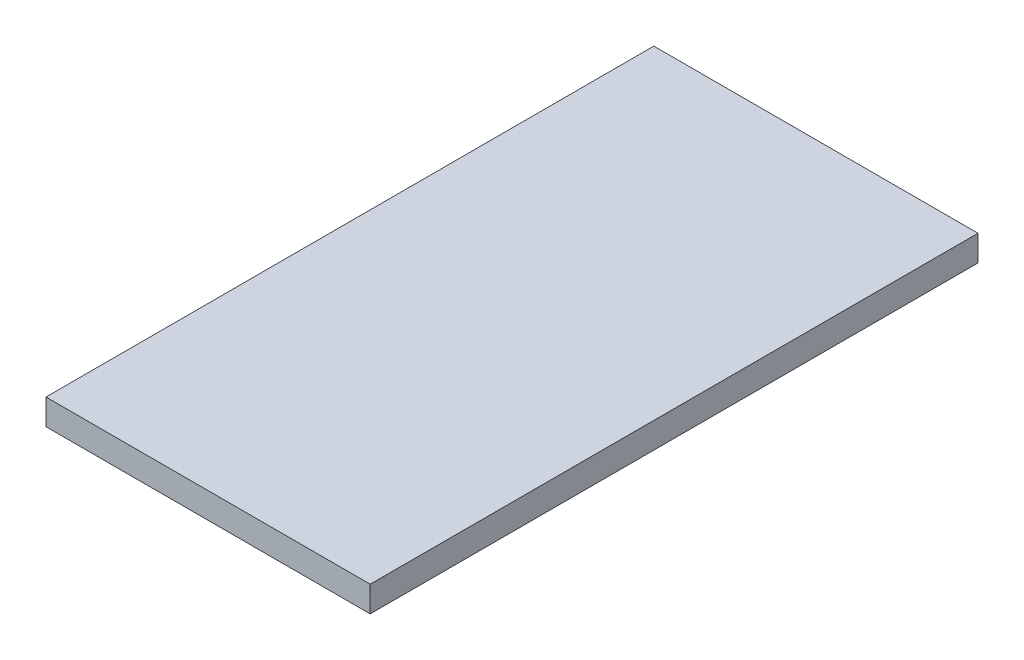
ISO-10303-21;
HEADER;
FILE_DESCRIPTION(('STEP AP214'),'2;1');
FILE_NAME('part.step','',(''),(''),'','','');
FILE_SCHEMA(('AUTOMOTIVE_DESIGN { 1 0 10303 214 1 1 1 1 }'));
ENDSEC;
DATA;
#1=APPLICATION_CONTEXT('core data for automotive mechanical design processes');
#2=APPLICATION_PROTOCOL_DEFINITION('international standard','automotive_design',2000,#1);
#3=PRODUCT_CONTEXT('',#1,'mechanical');
#4=PRODUCT('Part','Part','',(#3));
#5=PRODUCT_RELATED_PRODUCT_CATEGORY('part','',(#4));
#6=PRODUCT_DEFINITION_FORMATION('','',#4);
#7=PRODUCT_DEFINITION_CONTEXT('part definition',#1,'design');
#8=PRODUCT_DEFINITION('design','',#6,#7);
#9=PRODUCT_DEFINITION_SHAPE('','',#8);
#10=(LENGTH_UNIT() NAMED_UNIT(*) SI_UNIT(.MILLI.,.METRE.));
#11=(NAMED_UNIT(*) PLANE_ANGLE_UNIT() SI_UNIT($,.RADIAN.));
#12=(NAMED_UNIT(*) SI_UNIT($,.STERADIAN.) SOLID_ANGLE_UNIT());
#13=UNCERTAINTY_MEASURE_WITH_UNIT(LENGTH_MEASURE(1.E-05),#10,'distance_accuracy_value','');
#14=(GEOMETRIC_REPRESENTATION_CONTEXT(3) GLOBAL_UNCERTAINTY_ASSIGNED_CONTEXT((#13)) GLOBAL_UNIT_ASSIGNED_CONTEXT((#10,
#11,#12)) REPRESENTATION_CONTEXT('',''));
#15=CARTESIAN_POINT('',(0.,0.,0.));
#16=DIRECTION('',(0.,0.,1.));
#17=DIRECTION('',(1.,0.,0.));
#18=AXIS2_PLACEMENT_3D('',#15,#16,#17);
#19=CARTESIAN_POINT('',(0.,0.,0.));
#20=DIRECTION('',(0.,1.,0.));
#21=DIRECTION('',(0.,0.,1.));
#22=AXIS2_PLACEMENT_3D('',#19,#20,#21);
#23=PLANE('',#22);
#24=DIRECTION('',(-1.,0.,0.));
#25=VECTOR('',#24,1.);
#26=CARTESIAN_POINT('',(-160.,0.,300.));
#27=LINE('',#26,#25);
#28=CARTESIAN_POINT('',(160.,0.,300.));
#29=VERTEX_POINT('',#28);
#30=CARTESIAN_POINT('',(-160.,0.,300.));
#31=VERTEX_POINT('',#30);
#32=EDGE_CURVE('E81',#29,#31,#27,.T.);
#33=ORIENTED_EDGE('',*,*,#32,.T.);
#34=DIRECTION('',(0.,0.,-1.));
#35=VECTOR('',#34,1.);
#36=CARTESIAN_POINT('',(-160.,0.,-300.));
#37=LINE('',#36,#35);
#38=CARTESIAN_POINT('',(-160.,0.,-300.));
#39=VERTEX_POINT('',#38);
#40=EDGE_CURVE('E68',#31,#39,#37,.T.);
#41=ORIENTED_EDGE('',*,*,#40,.T.);
#42=DIRECTION('',(1.,0.,0.));
#43=VECTOR('',#42,1.);
#44=CARTESIAN_POINT('',(-160.,0.,-300.));
#45=LINE('',#44,#43);
#46=CARTESIAN_POINT('',(160.,0.,-300.));
#47=VERTEX_POINT('',#46);
#48=EDGE_CURVE('E55',#39,#47,#45,.T.);
#49=ORIENTED_EDGE('',*,*,#48,.T.);
#50=DIRECTION('',(0.,0.,1.));
#51=VECTOR('',#50,1.);
#52=CARTESIAN_POINT('',(160.,0.,-300.));
#53=LINE('',#52,#51);
#54=EDGE_CURVE('E20',#47,#29,#53,.T.);
#55=ORIENTED_EDGE('',*,*,#54,.T.);
#56=EDGE_LOOP('',(#33,#41,#49,#55));
#57=FACE_BOUND('',#56,.T.);
#58=ADVANCED_FACE('F17',(#57),#23,.F.);
#59=CARTESIAN_POINT('',(160.,25.4,-300.));
#60=DIRECTION('',(-1.,0.,0.));
#61=DIRECTION('',(0.,0.,1.));
#62=AXIS2_PLACEMENT_3D('',#59,#60,#61);
#63=PLANE('',#62);
#64=DIRECTION('',(0.,1.,0.));
#65=VECTOR('',#64,1.);
#66=CARTESIAN_POINT('',(160.,25.4,-300.));
#67=LINE('',#66,#65);
#68=CARTESIAN_POINT('',(160.,25.4,-300.));
#69=VERTEX_POINT('',#68);
#70=EDGE_CURVE('E61',#47,#69,#67,.T.);
#71=ORIENTED_EDGE('',*,*,#70,.T.);
#72=DIRECTION('',(0.,0.,1.));
#73=VECTOR('',#72,1.);
#74=CARTESIAN_POINT('',(160.,25.4,0.));
#75=LINE('',#74,#73);
#76=CARTESIAN_POINT('',(160.,25.4,300.));
#77=VERTEX_POINT('',#76);
#78=EDGE_CURVE('E83',#77,#69,#75,.F.);
#79=ORIENTED_EDGE('',*,*,#78,.F.);
#80=DIRECTION('',(0.,1.,0.));
#81=VECTOR('',#80,1.);
#82=CARTESIAN_POINT('',(160.,25.4,300.));
#83=LINE('',#82,#81);
#84=EDGE_CURVE('E64',#77,#29,#83,.F.);
#85=ORIENTED_EDGE('',*,*,#84,.T.);
#86=ORIENTED_EDGE('',*,*,#54,.F.);
#87=EDGE_LOOP('',(#71,#79,#85,#86));
#88=FACE_BOUND('',#87,.T.);
#89=ADVANCED_FACE('F60',(#88),#63,.F.);
#90=CARTESIAN_POINT('',(-160.,25.4,-300.));
#91=DIRECTION('',(0.,0.,1.));
#92=DIRECTION('',(1.,0.,0.));
#93=AXIS2_PLACEMENT_3D('',#90,#91,#92);
#94=PLANE('',#93);
#95=DIRECTION('',(0.,1.,0.));
#96=VECTOR('',#95,1.);
#97=CARTESIAN_POINT('',(-160.,25.4,-300.));
#98=LINE('',#97,#96);
#99=CARTESIAN_POINT('',(-160.,25.4,-300.));
#100=VERTEX_POINT('',#99);
#101=EDGE_CURVE('E70',#39,#100,#98,.T.);
#102=ORIENTED_EDGE('',*,*,#101,.T.);
#103=DIRECTION('',(1.,0.,0.));
#104=VECTOR('',#103,1.);
#105=CARTESIAN_POINT('',(0.,25.4,-300.));
#106=LINE('',#105,#104);
#107=EDGE_CURVE('E74',#69,#100,#106,.F.);
#108=ORIENTED_EDGE('',*,*,#107,.F.);
#109=ORIENTED_EDGE('',*,*,#70,.F.);
#110=ORIENTED_EDGE('',*,*,#48,.F.);
#111=EDGE_LOOP('',(#102,#108,#109,#110));
#112=FACE_BOUND('',#111,.T.);
#113=ADVANCED_FACE('F72',(#112),#94,.F.);
#114=CARTESIAN_POINT('',(-160.,25.4,-300.));
#115=DIRECTION('',(1.,0.,0.));
#116=DIRECTION('',(0.,0.,-1.));
#117=AXIS2_PLACEMENT_3D('',#114,#115,#116);
#118=PLANE('',#117);
#119=DIRECTION('',(0.,1.,0.));
#120=VECTOR('',#119,1.);
#121=CARTESIAN_POINT('',(-160.,25.4,300.));
#122=LINE('',#121,#120);
#123=CARTESIAN_POINT('',(-160.,25.4,300.));
#124=VERTEX_POINT('',#123);
#125=EDGE_CURVE('E35',#31,#124,#122,.T.);
#126=ORIENTED_EDGE('',*,*,#125,.T.);
#127=DIRECTION('',(0.,0.,1.));
#128=VECTOR('',#127,1.);
#129=CARTESIAN_POINT('',(-160.,25.4,0.));
#130=LINE('',#129,#128);
#131=EDGE_CURVE('E26',#100,#124,#130,.T.);
#132=ORIENTED_EDGE('',*,*,#131,.F.);
#133=ORIENTED_EDGE('',*,*,#101,.F.);
#134=ORIENTED_EDGE('',*,*,#40,.F.);
#135=EDGE_LOOP('',(#126,#132,#133,#134));
#136=FACE_BOUND('',#135,.T.);
#137=ADVANCED_FACE('F89',(#136),#118,.F.);
#138=CARTESIAN_POINT('',(-160.,25.4,300.));
#139=DIRECTION('',(0.,0.,-1.));
#140=DIRECTION('',(-1.,0.,0.));
#141=AXIS2_PLACEMENT_3D('',#138,#139,#140);
#142=PLANE('',#141);
#143=ORIENTED_EDGE('',*,*,#84,.F.);
#144=DIRECTION('',(1.,0.,0.));
#145=VECTOR('',#144,1.);
#146=CARTESIAN_POINT('',(0.,25.4,300.));
#147=LINE('',#146,#145);
#148=EDGE_CURVE('E11',#124,#77,#147,.T.);
#149=ORIENTED_EDGE('',*,*,#148,.F.);
#150=ORIENTED_EDGE('',*,*,#125,.F.);
#151=ORIENTED_EDGE('',*,*,#32,.F.);
#152=EDGE_LOOP('',(#143,#149,#150,#151));
#153=FACE_BOUND('',#152,.T.);
#154=ADVANCED_FACE('F91',(#153),#142,.F.);
#155=CARTESIAN_POINT('',(0.,25.4,0.));
#156=DIRECTION('',(0.,1.,0.));
#157=DIRECTION('',(0.,0.,1.));
#158=AXIS2_PLACEMENT_3D('',#155,#156,#157);
#159=PLANE('',#158);
#160=ORIENTED_EDGE('',*,*,#131,.T.);
#161=ORIENTED_EDGE('',*,*,#148,.T.);
#162=ORIENTED_EDGE('',*,*,#78,.T.);
#163=ORIENTED_EDGE('',*,*,#107,.T.);
#164=EDGE_LOOP('',(#160,#161,#162,#163));
#165=FACE_BOUND('',#164,.T.);
#166=ADVANCED_FACE('F88',(#165),#159,.T.);
#167=CLOSED_SHELL('',(#58,#89,#113,#137,#154,#166));
#168=MANIFOLD_SOLID_BREP('B1',#167);
#169=ADVANCED_BREP_SHAPE_REPRESENTATION('',(#18,#168),#14);
#170=SHAPE_DEFINITION_REPRESENTATION(#9,#169);
ENDSEC;
END-ISO-10303-21;
